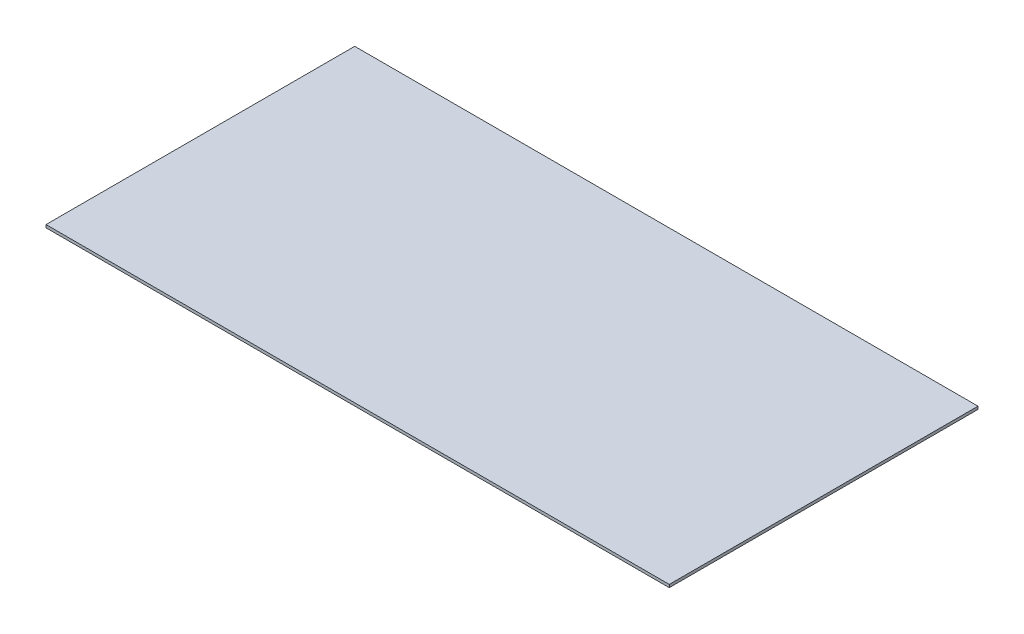
ISO-10303-21;
HEADER;
FILE_DESCRIPTION(('STEP AP214'),'2;1');
FILE_NAME('part.step','',(''),(''),'','','');
FILE_SCHEMA(('AUTOMOTIVE_DESIGN { 1 0 10303 214 1 1 1 1 }'));
ENDSEC;
DATA;
#1=APPLICATION_CONTEXT('core data for automotive mechanical design processes');
#2=APPLICATION_PROTOCOL_DEFINITION('international standard','automotive_design',2000,#1);
#3=PRODUCT_CONTEXT('',#1,'mechanical');
#4=PRODUCT('Part','Part','',(#3));
#5=PRODUCT_RELATED_PRODUCT_CATEGORY('part','',(#4));
#6=PRODUCT_DEFINITION_FORMATION('','',#4);
#7=PRODUCT_DEFINITION_CONTEXT('part definition',#1,'design');
#8=PRODUCT_DEFINITION('design','',#6,#7);
#9=PRODUCT_DEFINITION_SHAPE('','',#8);
#10=(LENGTH_UNIT() NAMED_UNIT(*) SI_UNIT(.MILLI.,.METRE.));
#11=(NAMED_UNIT(*) PLANE_ANGLE_UNIT() SI_UNIT($,.RADIAN.));
#12=(NAMED_UNIT(*) SI_UNIT($,.STERADIAN.) SOLID_ANGLE_UNIT());
#13=UNCERTAINTY_MEASURE_WITH_UNIT(LENGTH_MEASURE(1.E-05),#10,'distance_accuracy_value','');
#14=(GEOMETRIC_REPRESENTATION_CONTEXT(3) GLOBAL_UNCERTAINTY_ASSIGNED_CONTEXT((#13)) GLOBAL_UNIT_ASSIGNED_CONTEXT((#10,
#11,#12)) REPRESENTATION_CONTEXT('',''));
#15=CARTESIAN_POINT('',(0.,0.,0.));
#16=DIRECTION('',(0.,0.,1.));
#17=DIRECTION('',(1.,0.,0.));
#18=AXIS2_PLACEMENT_3D('',#15,#16,#17);
#19=CARTESIAN_POINT('',(609.6,5.55625,301.9425));
#20=DIRECTION('',(-1.,0.,0.));
#21=DIRECTION('',(0.,0.,1.));
#22=AXIS2_PLACEMENT_3D('',#19,#20,#21);
#23=PLANE('',#22);
#24=DIRECTION('',(0.,0.,-1.));
#25=VECTOR('',#24,1.);
#26=CARTESIAN_POINT('',(609.6,0.,301.9425));
#27=LINE('',#26,#25);
#28=CARTESIAN_POINT('',(609.6,0.,301.9425));
#29=VERTEX_POINT('',#28);
#30=CARTESIAN_POINT('',(609.6,0.,-301.9425));
#31=VERTEX_POINT('',#30);
#32=EDGE_CURVE('E102',#29,#31,#27,.T.);
#33=ORIENTED_EDGE('',*,*,#32,.T.);
#34=DIRECTION('',(0.,-1.,0.));
#35=VECTOR('',#34,1.);
#36=CARTESIAN_POINT('',(609.6,5.55625,-301.9425));
#37=LINE('',#36,#35);
#38=CARTESIAN_POINT('',(609.6,5.55625,-301.9425));
#39=VERTEX_POINT('',#38);
#40=EDGE_CURVE('E11',#39,#31,#37,.T.);
#41=ORIENTED_EDGE('',*,*,#40,.F.);
#42=DIRECTION('',(0.,0.,-1.));
#43=VECTOR('',#42,1.);
#44=CARTESIAN_POINT('',(609.6,5.55625,301.9425));
#45=LINE('',#44,#43);
#46=CARTESIAN_POINT('',(609.6,5.55625,301.9425));
#47=VERTEX_POINT('',#46);
#48=EDGE_CURVE('E90',#47,#39,#45,.T.);
#49=ORIENTED_EDGE('',*,*,#48,.F.);
#50=DIRECTION('',(0.,-1.,0.));
#51=VECTOR('',#50,1.);
#52=CARTESIAN_POINT('',(609.6,5.55625,301.9425));
#53=LINE('',#52,#51);
#54=EDGE_CURVE('E98',#47,#29,#53,.T.);
#55=ORIENTED_EDGE('',*,*,#54,.T.);
#56=EDGE_LOOP('',(#33,#41,#49,#55));
#57=FACE_BOUND('',#56,.T.);
#58=ADVANCED_FACE('F39',(#57),#23,.F.);
#59=CARTESIAN_POINT('',(-609.6,5.55625,-301.9425));
#60=DIRECTION('',(0.,0.,1.));
#61=DIRECTION('',(1.,0.,0.));
#62=AXIS2_PLACEMENT_3D('',#59,#60,#61);
#63=PLANE('',#62);
#64=DIRECTION('',(-1.,0.,0.));
#65=VECTOR('',#64,1.);
#66=CARTESIAN_POINT('',(-609.6,0.,-301.9425));
#67=LINE('',#66,#65);
#68=CARTESIAN_POINT('',(-609.6,0.,-301.9425));
#69=VERTEX_POINT('',#68);
#70=EDGE_CURVE('E94',#31,#69,#67,.T.);
#71=ORIENTED_EDGE('',*,*,#70,.T.);
#72=DIRECTION('',(0.,-1.,0.));
#73=VECTOR('',#72,1.);
#74=CARTESIAN_POINT('',(-609.6,5.55625,-301.9425));
#75=LINE('',#74,#73);
#76=CARTESIAN_POINT('',(-609.6,5.55625,-301.9425));
#77=VERTEX_POINT('',#76);
#78=EDGE_CURVE('E47',#77,#69,#75,.T.);
#79=ORIENTED_EDGE('',*,*,#78,.F.);
#80=DIRECTION('',(-1.,0.,0.));
#81=VECTOR('',#80,1.);
#82=CARTESIAN_POINT('',(-609.6,5.55625,-301.9425));
#83=LINE('',#82,#81);
#84=EDGE_CURVE('E85',#39,#77,#83,.T.);
#85=ORIENTED_EDGE('',*,*,#84,.F.);
#86=ORIENTED_EDGE('',*,*,#40,.T.);
#87=EDGE_LOOP('',(#71,#79,#85,#86));
#88=FACE_BOUND('',#87,.T.);
#89=ADVANCED_FACE('F93',(#88),#63,.F.);
#90=CARTESIAN_POINT('',(-609.6,5.55625,301.9425));
#91=DIRECTION('',(1.,0.,0.));
#92=DIRECTION('',(0.,0.,-1.));
#93=AXIS2_PLACEMENT_3D('',#90,#91,#92);
#94=PLANE('',#93);
#95=DIRECTION('',(0.,0.,1.));
#96=VECTOR('',#95,1.);
#97=CARTESIAN_POINT('',(-609.6,0.,301.9425));
#98=LINE('',#97,#96);
#99=CARTESIAN_POINT('',(-609.6,0.,301.9425));
#100=VERTEX_POINT('',#99);
#101=EDGE_CURVE('E72',#69,#100,#98,.T.);
#102=ORIENTED_EDGE('',*,*,#101,.T.);
#103=DIRECTION('',(0.,-1.,0.));
#104=VECTOR('',#103,1.);
#105=CARTESIAN_POINT('',(-609.6,5.55625,301.9425));
#106=LINE('',#105,#104);
#107=CARTESIAN_POINT('',(-609.6,5.55625,301.9425));
#108=VERTEX_POINT('',#107);
#109=EDGE_CURVE('E95',#108,#100,#106,.T.);
#110=ORIENTED_EDGE('',*,*,#109,.F.);
#111=DIRECTION('',(0.,0.,1.));
#112=VECTOR('',#111,1.);
#113=CARTESIAN_POINT('',(-609.6,5.55625,301.9425));
#114=LINE('',#113,#112);
#115=EDGE_CURVE('E88',#77,#108,#114,.T.);
#116=ORIENTED_EDGE('',*,*,#115,.F.);
#117=ORIENTED_EDGE('',*,*,#78,.T.);
#118=EDGE_LOOP('',(#102,#110,#116,#117));
#119=FACE_BOUND('',#118,.T.);
#120=ADVANCED_FACE('F96',(#119),#94,.F.);
#121=CARTESIAN_POINT('',(-609.6,5.55625,301.9425));
#122=DIRECTION('',(0.,0.,-1.));
#123=DIRECTION('',(-1.,0.,0.));
#124=AXIS2_PLACEMENT_3D('',#121,#122,#123);
#125=PLANE('',#124);
#126=DIRECTION('',(1.,0.,0.));
#127=VECTOR('',#126,1.);
#128=CARTESIAN_POINT('',(-609.6,0.,301.9425));
#129=LINE('',#128,#127);
#130=EDGE_CURVE('E78',#100,#29,#129,.T.);
#131=ORIENTED_EDGE('',*,*,#130,.T.);
#132=ORIENTED_EDGE('',*,*,#54,.F.);
#133=DIRECTION('',(1.,0.,0.));
#134=VECTOR('',#133,1.);
#135=CARTESIAN_POINT('',(-609.6,5.55625,301.9425));
#136=LINE('',#135,#134);
#137=EDGE_CURVE('E55',#108,#47,#136,.T.);
#138=ORIENTED_EDGE('',*,*,#137,.F.);
#139=ORIENTED_EDGE('',*,*,#109,.T.);
#140=EDGE_LOOP('',(#131,#132,#138,#139));
#141=FACE_BOUND('',#140,.T.);
#142=ADVANCED_FACE('F109',(#141),#125,.F.);
#143=CARTESIAN_POINT('',(0.,5.55625,0.));
#144=DIRECTION('',(0.,-1.,0.));
#145=DIRECTION('',(0.,0.,-1.));
#146=AXIS2_PLACEMENT_3D('',#143,#144,#145);
#147=PLANE('',#146);
#148=ORIENTED_EDGE('',*,*,#48,.T.);
#149=ORIENTED_EDGE('',*,*,#84,.T.);
#150=ORIENTED_EDGE('',*,*,#115,.T.);
#151=ORIENTED_EDGE('',*,*,#137,.T.);
#152=EDGE_LOOP('',(#148,#149,#150,#151));
#153=FACE_BOUND('',#152,.T.);
#154=ADVANCED_FACE('F86',(#153),#147,.F.);
#155=CARTESIAN_POINT('',(0.,0.,0.));
#156=DIRECTION('',(0.,-1.,0.));
#157=DIRECTION('',(0.,0.,-1.));
#158=AXIS2_PLACEMENT_3D('',#155,#156,#157);
#159=PLANE('',#158);
#160=ORIENTED_EDGE('',*,*,#32,.F.);
#161=ORIENTED_EDGE('',*,*,#130,.F.);
#162=ORIENTED_EDGE('',*,*,#101,.F.);
#163=ORIENTED_EDGE('',*,*,#70,.F.);
#164=EDGE_LOOP('',(#160,#161,#162,#163));
#165=FACE_BOUND('',#164,.T.);
#166=ADVANCED_FACE('F112',(#165),#159,.T.);
#167=CLOSED_SHELL('',(#58,#89,#120,#142,#154,#166));
#168=MANIFOLD_SOLID_BREP('B2',#167);
#169=ADVANCED_BREP_SHAPE_REPRESENTATION('',(#18,#168),#14);
#170=SHAPE_DEFINITION_REPRESENTATION(#9,#169);
ENDSEC;
END-ISO-10303-21;
